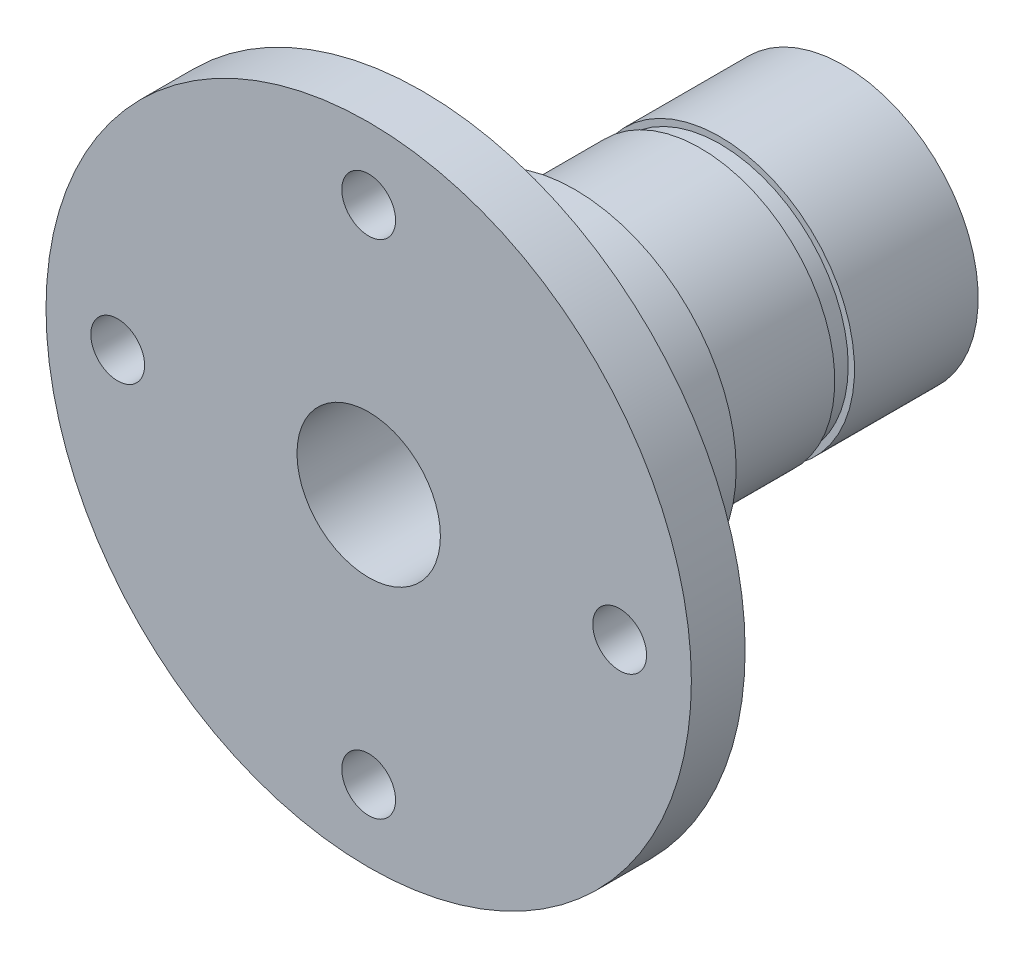
ISO-10303-21;
HEADER;
FILE_DESCRIPTION(('STEP AP214'),'2;1');
FILE_NAME('part.step','',(''),(''),'','','');
FILE_SCHEMA(('AUTOMOTIVE_DESIGN { 1 0 10303 214 1 1 1 1 }'));
ENDSEC;
DATA;
#1=APPLICATION_CONTEXT('core data for automotive mechanical design processes');
#2=APPLICATION_PROTOCOL_DEFINITION('international standard','automotive_design',2000,#1);
#3=PRODUCT_CONTEXT('',#1,'mechanical');
#4=PRODUCT('Part','Part','',(#3));
#5=PRODUCT_RELATED_PRODUCT_CATEGORY('part','',(#4));
#6=PRODUCT_DEFINITION_FORMATION('','',#4);
#7=PRODUCT_DEFINITION_CONTEXT('part definition',#1,'design');
#8=PRODUCT_DEFINITION('design','',#6,#7);
#9=PRODUCT_DEFINITION_SHAPE('','',#8);
#10=(LENGTH_UNIT() NAMED_UNIT(*) SI_UNIT(.MILLI.,.METRE.));
#11=(NAMED_UNIT(*) PLANE_ANGLE_UNIT() SI_UNIT($,.RADIAN.));
#12=(NAMED_UNIT(*) SI_UNIT($,.STERADIAN.) SOLID_ANGLE_UNIT());
#13=UNCERTAINTY_MEASURE_WITH_UNIT(LENGTH_MEASURE(1.E-05),#10,'distance_accuracy_value','');
#14=(GEOMETRIC_REPRESENTATION_CONTEXT(3) GLOBAL_UNCERTAINTY_ASSIGNED_CONTEXT((#13)) GLOBAL_UNIT_ASSIGNED_CONTEXT((#10,
#11,#12)) REPRESENTATION_CONTEXT('',''));
#15=CARTESIAN_POINT('',(0.,0.,0.));
#16=DIRECTION('',(0.,0.,1.));
#17=DIRECTION('',(1.,0.,0.));
#18=AXIS2_PLACEMENT_3D('',#15,#16,#17);
#19=CARTESIAN_POINT('',(0.,0.,-23.5));
#20=DIRECTION('',(0.,0.,1.));
#21=DIRECTION('',(1.,0.,0.));
#22=AXIS2_PLACEMENT_3D('',#19,#20,#21);
#23=CYLINDRICAL_SURFACE('',#22,7.5);
#24=CARTESIAN_POINT('',(0.,0.,-8.5));
#25=DIRECTION('',(0.,0.,-1.));
#26=DIRECTION('',(-1.,0.,0.));
#27=AXIS2_PLACEMENT_3D('',#24,#25,#26);
#28=CIRCLE('',#27,7.5);
#29=CARTESIAN_POINT('',(-7.5,0.,-8.5));
#30=VERTEX_POINT('',#29);
#31=EDGE_CURVE('E10',#30,#30,#28,.T.);
#32=ORIENTED_EDGE('',*,*,#31,.T.);
#33=EDGE_LOOP('',(#32));
#34=FACE_BOUND('',#33,.T.);
#35=CARTESIAN_POINT('',(0.,0.,-15.5));
#36=DIRECTION('',(0.,0.,-1.));
#37=DIRECTION('',(-1.,0.,0.));
#38=AXIS2_PLACEMENT_3D('',#35,#36,#37);
#39=CIRCLE('',#38,7.5);
#40=CARTESIAN_POINT('',(-7.5,0.,-15.5));
#41=VERTEX_POINT('',#40);
#42=EDGE_CURVE('E143',#41,#41,#39,.T.);
#43=ORIENTED_EDGE('',*,*,#42,.F.);
#44=EDGE_LOOP('',(#43));
#45=FACE_BOUND('',#44,.T.);
#46=ADVANCED_FACE('F33',(#34,#45),#23,.T.);
#47=CARTESIAN_POINT('',(0.,0.,0.));
#48=DIRECTION('',(0.,0.,1.));
#49=DIRECTION('',(1.,0.,0.));
#50=AXIS2_PLACEMENT_3D('',#47,#48,#49);
#51=PLANE('',#50);
#52=CARTESIAN_POINT('',(-13.9999999999997,-3.12516339054529E-13,0.));
#53=DIRECTION('',(0.,0.,1.));
#54=DIRECTION('',(1.,0.,0.));
#55=AXIS2_PLACEMENT_3D('',#52,#53,#54);
#56=CIRCLE('',#55,1.50000000000067);
#57=CARTESIAN_POINT('',(-12.499999999999,-3.12516339054529E-13,0.));
#58=VERTEX_POINT('',#57);
#59=EDGE_CURVE('E53',#58,#58,#56,.T.);
#60=ORIENTED_EDGE('',*,*,#59,.T.);
#61=EDGE_LOOP('',(#60));
#62=FACE_BOUND('',#61,.T.);
#63=CARTESIAN_POINT('',(6.21603667071446E-13,-14.,0.));
#64=DIRECTION('',(0.,0.,1.));
#65=DIRECTION('',(1.,0.,0.));
#66=AXIS2_PLACEMENT_3D('',#63,#64,#65);
#67=CIRCLE('',#66,1.50000000000067);
#68=CARTESIAN_POINT('',(1.50000000000129,-14.,0.));
#69=VERTEX_POINT('',#68);
#70=EDGE_CURVE('E57',#69,#69,#67,.T.);
#71=ORIENTED_EDGE('',*,*,#70,.T.);
#72=EDGE_LOOP('',(#71));
#73=FACE_BOUND('',#72,.T.);
#74=CARTESIAN_POINT('',(14.0000000000003,3.10801833535723E-13,0.));
#75=DIRECTION('',(0.,0.,1.));
#76=DIRECTION('',(1.,0.,0.));
#77=AXIS2_PLACEMENT_3D('',#74,#75,#76);
#78=CIRCLE('',#77,1.50000000000067);
#79=CARTESIAN_POINT('',(15.500000000001,3.10801833535723E-13,0.));
#80=VERTEX_POINT('',#79);
#81=EDGE_CURVE('E63',#80,#80,#78,.T.);
#82=ORIENTED_EDGE('',*,*,#81,.T.);
#83=EDGE_LOOP('',(#82));
#84=FACE_BOUND('',#83,.T.);
#85=CARTESIAN_POINT('',(0.,14.,0.));
#86=DIRECTION('',(0.,0.,1.));
#87=DIRECTION('',(1.,0.,0.));
#88=AXIS2_PLACEMENT_3D('',#85,#86,#87);
#89=CIRCLE('',#88,1.50000000000067);
#90=CARTESIAN_POINT('',(1.50000000000067,14.,0.));
#91=VERTEX_POINT('',#90);
#92=EDGE_CURVE('E69',#91,#91,#89,.T.);
#93=ORIENTED_EDGE('',*,*,#92,.T.);
#94=EDGE_LOOP('',(#93));
#95=FACE_BOUND('',#94,.T.);
#96=CARTESIAN_POINT('',(0.,0.,0.));
#97=DIRECTION('',(0.,0.,1.));
#98=DIRECTION('',(1.,0.,0.));
#99=AXIS2_PLACEMENT_3D('',#96,#97,#98);
#100=CIRCLE('',#99,18.);
#101=CARTESIAN_POINT('',(18.,0.,0.));
#102=VERTEX_POINT('',#101);
#103=EDGE_CURVE('E80',#102,#102,#100,.T.);
#104=ORIENTED_EDGE('',*,*,#103,.F.);
#105=EDGE_LOOP('',(#104));
#106=FACE_BOUND('',#105,.T.);
#107=CARTESIAN_POINT('',(0.,0.,0.));
#108=DIRECTION('',(0.,0.,1.));
#109=DIRECTION('',(1.,0.,0.));
#110=AXIS2_PLACEMENT_3D('',#107,#108,#109);
#111=CIRCLE('',#110,9.);
#112=CARTESIAN_POINT('',(9.,0.,0.));
#113=VERTEX_POINT('',#112);
#114=EDGE_CURVE('E37',#113,#113,#111,.F.);
#115=ORIENTED_EDGE('',*,*,#114,.F.);
#116=EDGE_LOOP('',(#115));
#117=FACE_BOUND('',#116,.T.);
#118=ADVANCED_FACE('F86',(#62,#73,#84,#95,#106,#117),#51,.F.);
#119=CARTESIAN_POINT('',(0.,0.,3.));
#120=DIRECTION('',(0.,0.,1.));
#121=DIRECTION('',(1.,0.,0.));
#122=AXIS2_PLACEMENT_3D('',#119,#120,#121);
#123=PLANE('',#122);
#124=CARTESIAN_POINT('',(6.21603667071446E-13,-14.,3.));
#125=DIRECTION('',(0.,0.,1.));
#126=DIRECTION('',(1.,0.,0.));
#127=AXIS2_PLACEMENT_3D('',#124,#125,#126);
#128=CIRCLE('',#127,1.50000000000067);
#129=CARTESIAN_POINT('',(1.50000000000129,-14.,3.));
#130=VERTEX_POINT('',#129);
#131=EDGE_CURVE('E60',#130,#130,#128,.T.);
#132=ORIENTED_EDGE('',*,*,#131,.F.);
#133=EDGE_LOOP('',(#132));
#134=FACE_BOUND('',#133,.T.);
#135=CARTESIAN_POINT('',(0.,14.,3.));
#136=DIRECTION('',(0.,0.,1.));
#137=DIRECTION('',(1.,0.,0.));
#138=AXIS2_PLACEMENT_3D('',#135,#136,#137);
#139=CIRCLE('',#138,1.50000000000067);
#140=CARTESIAN_POINT('',(1.50000000000067,14.,3.));
#141=VERTEX_POINT('',#140);
#142=EDGE_CURVE('E72',#141,#141,#139,.T.);
#143=ORIENTED_EDGE('',*,*,#142,.F.);
#144=EDGE_LOOP('',(#143));
#145=FACE_BOUND('',#144,.T.);
#146=CARTESIAN_POINT('',(0.,0.,3.));
#147=DIRECTION('',(0.,0.,1.));
#148=DIRECTION('',(1.,0.,0.));
#149=AXIS2_PLACEMENT_3D('',#146,#147,#148);
#150=CIRCLE('',#149,18.);
#151=CARTESIAN_POINT('',(18.,0.,3.));
#152=VERTEX_POINT('',#151);
#153=EDGE_CURVE('E45',#152,#152,#150,.T.);
#154=ORIENTED_EDGE('',*,*,#153,.T.);
#155=EDGE_LOOP('',(#154));
#156=FACE_BOUND('',#155,.T.);
#157=CARTESIAN_POINT('',(0.,0.,3.));
#158=DIRECTION('',(0.,0.,1.));
#159=DIRECTION('',(1.,0.,0.));
#160=AXIS2_PLACEMENT_3D('',#157,#158,#159);
#161=CIRCLE('',#160,4.);
#162=CARTESIAN_POINT('',(4.,0.,3.));
#163=VERTEX_POINT('',#162);
#164=EDGE_CURVE('E75',#163,#163,#161,.T.);
#165=ORIENTED_EDGE('',*,*,#164,.F.);
#166=EDGE_LOOP('',(#165));
#167=FACE_BOUND('',#166,.T.);
#168=CARTESIAN_POINT('',(14.0000000000003,3.10801833535723E-13,3.));
#169=DIRECTION('',(0.,0.,1.));
#170=DIRECTION('',(1.,0.,0.));
#171=AXIS2_PLACEMENT_3D('',#168,#169,#170);
#172=CIRCLE('',#171,1.50000000000067);
#173=CARTESIAN_POINT('',(15.500000000001,3.10801833535723E-13,3.));
#174=VERTEX_POINT('',#173);
#175=EDGE_CURVE('E66',#174,#174,#172,.T.);
#176=ORIENTED_EDGE('',*,*,#175,.F.);
#177=EDGE_LOOP('',(#176));
#178=FACE_BOUND('',#177,.T.);
#179=CARTESIAN_POINT('',(-13.9999999999997,-3.12516339054529E-13,3.));
#180=DIRECTION('',(0.,0.,1.));
#181=DIRECTION('',(1.,0.,0.));
#182=AXIS2_PLACEMENT_3D('',#179,#180,#181);
#183=CIRCLE('',#182,1.50000000000067);
#184=CARTESIAN_POINT('',(-12.499999999999,-3.12516339054529E-13,3.));
#185=VERTEX_POINT('',#184);
#186=EDGE_CURVE('E54',#185,#185,#183,.T.);
#187=ORIENTED_EDGE('',*,*,#186,.F.);
#188=EDGE_LOOP('',(#187));
#189=FACE_BOUND('',#188,.T.);
#190=ADVANCED_FACE('F89',(#134,#145,#156,#167,#178,#189),#123,.T.);
#191=CARTESIAN_POINT('',(0.,0.,3.));
#192=DIRECTION('',(0.,0.,-1.));
#193=DIRECTION('',(-1.,0.,0.));
#194=AXIS2_PLACEMENT_3D('',#191,#192,#193);
#195=CYLINDRICAL_SURFACE('',#194,18.);
#196=ORIENTED_EDGE('',*,*,#153,.F.);
#197=EDGE_LOOP('',(#196));
#198=FACE_BOUND('',#197,.T.);
#199=ORIENTED_EDGE('',*,*,#103,.T.);
#200=EDGE_LOOP('',(#199));
#201=FACE_BOUND('',#200,.T.);
#202=ADVANCED_FACE('F35',(#198,#201),#195,.T.);
#203=CARTESIAN_POINT('',(0.,0.,3.));
#204=DIRECTION('',(0.,0.,-1.));
#205=DIRECTION('',(-1.,0.,0.));
#206=AXIS2_PLACEMENT_3D('',#203,#204,#205);
#207=CYLINDRICAL_SURFACE('',#206,4.);
#208=CARTESIAN_POINT('',(-4.,0.,-19.1));
#209=CARTESIAN_POINT('',(-4.00000217456151,-0.0812350589378528,-19.0999970976969));
#210=CARTESIAN_POINT('',(-3.99750379283184,-0.162450241781792,-19.1066197602484));
#211=CARTESIAN_POINT('',(-3.98778696006928,-0.322453452352361,-19.1328281952699));
#212=CARTESIAN_POINT('',(-3.98056918893993,-0.401241827987616,-19.1524121004706));
#213=CARTESIAN_POINT('',(-3.96218832391545,-0.554060784990879,-19.2037530017718));
#214=CARTESIAN_POINT('',(-3.9510328434944,-0.628100224162278,-19.2354865168218));
#215=CARTESIAN_POINT('',(-3.92588767765353,-0.769799310160255,-19.3101064130158));
#216=CARTESIAN_POINT('',(-3.91189723227548,-0.83745723917788,-19.3529957855442));
#217=CARTESIAN_POINT('',(-3.88186246971217,-0.967346417045826,-19.4506125310709));
#218=CARTESIAN_POINT('',(-3.86576002583566,-1.02927073015119,-19.5057302622594));
#219=CARTESIAN_POINT('',(-3.83360220871327,-1.14324421474363,-19.6254104346588));
#220=CARTESIAN_POINT('',(-3.81754685135033,-1.19529036359203,-19.6899757560879));
#221=CARTESIAN_POINT('',(-3.78662470617731,-1.28998202215985,-19.8297174675232));
#222=CARTESIAN_POINT('',(-3.77182648820818,-1.3321939319576,-19.9052043665458));
#223=CARTESIAN_POINT('',(-3.74599860237433,-1.40318646334085,-20.0628483541685));
#224=CARTESIAN_POINT('',(-3.73496742975881,-1.43197244961239,-20.1450027631551));
#225=CARTESIAN_POINT('',(-3.71854412824136,-1.47408431017549,-20.3101167402582));
#226=CARTESIAN_POINT('',(-3.71293924350838,-1.48799593218558,-20.3929050384354));
#227=CARTESIAN_POINT('',(-3.70738061461215,-1.50179556531648,-20.5598161579938));
#228=CARTESIAN_POINT('',(-3.70742453659305,-1.50168936802631,-20.6439384138745));
#229=CARTESIAN_POINT('',(-3.71297511632055,-1.48790429610018,-20.805769525213));
#230=CARTESIAN_POINT('',(-3.71815468871121,-1.47503808509003,-20.8835609060442));
#231=CARTESIAN_POINT('',(-3.73284938059529,-1.4374416786833,-21.0357871504053));
#232=CARTESIAN_POINT('',(-3.74236515298863,-1.41270969663258,-21.1102215066139));
#233=CARTESIAN_POINT('',(-3.76485702190253,-1.35163748571904,-21.2552770677282));
#234=CARTESIAN_POINT('',(-3.77789517988166,-1.31508648737101,-21.3257994861213));
#235=CARTESIAN_POINT('',(-3.80594210139319,-1.23156073762698,-21.459945737591));
#236=CARTESIAN_POINT('',(-3.82095154457158,-1.18458238728897,-21.5235671775197));
#237=CARTESIAN_POINT('',(-3.85248038859113,-1.07781780766549,-21.6466036636509));
#238=CARTESIAN_POINT('',(-3.86903347455671,-1.01738298716956,-21.7054486407481));
#239=CARTESIAN_POINT('',(-3.90091728164085,-0.887312590819021,-21.8123379662058));
#240=CARTESIAN_POINT('',(-3.91624781465952,-0.817675603497364,-21.8603806546057));
#241=CARTESIAN_POINT('',(-3.9442639480908,-0.66972343699242,-21.9449303970625));
#242=CARTESIAN_POINT('',(-3.95690498259616,-0.59129071384472,-21.9812475812211));
#243=CARTESIAN_POINT('',(-3.97778718326962,-0.428836850524584,-22.03998260427));
#244=CARTESIAN_POINT('',(-3.98603030341493,-0.344818210845768,-22.0624066165611));
#245=CARTESIAN_POINT('',(-3.99684443228065,-0.178375243148666,-22.0916227875419));
#246=CARTESIAN_POINT('',(-3.99969369025686,-0.0961036195622097,-22.0991826063825));
#247=CARTESIAN_POINT('',(-4.00025893700126,0.0685724752550241,-22.1006910638999));
#248=CARTESIAN_POINT('',(-3.99797606386863,0.150976912983373,-22.0946427203168));
#249=CARTESIAN_POINT('',(-3.98871709772643,0.310262048561859,-22.0696899576913));
#250=CARTESIAN_POINT('',(-3.98192470962305,0.387233328007336,-22.0512884562629));
#251=CARTESIAN_POINT('',(-3.96451477091717,0.53694175495722,-22.0028139274527));
#252=CARTESIAN_POINT('',(-3.9538967228203,0.609678350347534,-21.972739382052));
#253=CARTESIAN_POINT('',(-3.92949624407681,0.751247765110155,-21.9008135875605));
#254=CARTESIAN_POINT('',(-3.91563000209348,0.819903083557796,-21.8586422707766));
#255=CARTESIAN_POINT('',(-3.88626671564664,0.949392711726626,-21.7640818968284));
#256=CARTESIAN_POINT('',(-3.87076907009516,1.01022412027045,-21.7116890674548));
#257=CARTESIAN_POINT('',(-3.83873329490989,1.12603079874454,-21.5945958778757));
#258=CARTESIAN_POINT('',(-3.82218696503729,1.18046154123569,-21.5293578172273));
#259=CARTESIAN_POINT('',(-3.79078815746854,1.27771050031903,-21.3903486152923));
#260=CARTESIAN_POINT('',(-3.77593583194399,1.32052767414519,-21.3165767086115));
#261=CARTESIAN_POINT('',(-3.74966829822463,1.39337773518998,-21.1619840132277));
#262=CARTESIAN_POINT('',(-3.73826760328493,1.42335685446918,-21.0811352540896));
#263=CARTESIAN_POINT('',(-3.72054032891005,1.46907883466889,-20.9149902363122));
#264=CARTESIAN_POINT('',(-3.71421061057491,1.48483050305535,-20.8296967638019));
#265=CARTESIAN_POINT('',(-3.70775894792573,1.50086347097839,-20.6629838404589));
#266=CARTESIAN_POINT('',(-3.70726444523341,1.50207331495837,-20.5816673682831));
#267=CARTESIAN_POINT('',(-3.71158412745292,1.49136715641593,-20.4200546837238));
#268=CARTESIAN_POINT('',(-3.71639780898899,1.47945239850124,-20.3397583753284));
#269=CARTESIAN_POINT('',(-3.73048141585432,1.44355815630242,-20.1849527732834));
#270=CARTESIAN_POINT('',(-3.73961085376663,1.41995798316524,-20.1103416537547));
#271=CARTESIAN_POINT('',(-3.76121548297845,1.3616969677992,-19.9660944915056));
#272=CARTESIAN_POINT('',(-3.77369151995215,1.32703332944945,-19.8964597119299));
#273=CARTESIAN_POINT('',(-3.80139723903965,1.24552075938154,-19.7601732103024));
#274=CARTESIAN_POINT('',(-3.81673698440964,1.1981283280301,-19.6938692032001));
#275=CARTESIAN_POINT('',(-3.84806246757177,1.09334485729906,-19.5698584390288));
#276=CARTESIAN_POINT('',(-3.86404840943145,1.03595064012808,-19.5121544252132));
#277=CARTESIAN_POINT('',(-3.89590424609881,0.909080396784624,-19.4037980441782));
#278=CARTESIAN_POINT('',(-3.91172104900645,0.839118644212993,-19.3536962465653));
#279=CARTESIAN_POINT('',(-3.9405451445703,0.691213223200822,-19.2659773447234));
#280=CARTESIAN_POINT('',(-3.95355221851559,0.613268934090623,-19.2283612122636));
#281=CARTESIAN_POINT('',(-3.9757429260668,0.447999082002313,-19.1656231709517));
#282=CARTESIAN_POINT('',(-3.98473657158356,0.360413422234208,-19.1411129353981));
#283=CARTESIAN_POINT('',(-3.99686242179587,0.181875733606382,-19.1083070400793));
#284=CARTESIAN_POINT('',(-3.99999756603967,0.0909254163648587,-19.1000032485127));
#285=CARTESIAN_POINT('',(-4.,0.,-19.1));
#286=B_SPLINE_CURVE_WITH_KNOTS('',3,(#208,#209,#210,#211,#212,#213,#214,#215,#216,#217,#218,
#219,#220,#221,#222,#223,#224,#225,#226,#227,#228,#229,#230,#231,#232,#233,#234,#235,#236,#237,
#238,#239,#240,#241,#242,#243,#244,#245,#246,#247,#248,#249,#250,#251,#252,#253,#254,#255,#256,
#257,#258,#259,#260,#261,#262,#263,#264,#265,#266,#267,#268,#269,#270,#271,#272,#273,#274,#275,
#276,#277,#278,#279,#280,#281,#282,#283,#284,#285),.UNSPECIFIED.,.T.,.F.,(4,2,2,2,2,2,2,2,2,2,2,
2,2,2,2,2,2,2,2,2,2,2,2,2,2,2,2,2,2,2,2,2,2,2,2,2,2,2,4),(0.,0.24336980156056,0.48670454953046,
0.729571369213573,0.972503379609492,1.22473618582716,1.47704604925622,1.73896674501659,
2.00078269352134,2.25185874416902,2.50283106079707,2.73878345119972,2.97477138060589,
3.21522408387018,3.45575990744259,3.71246153335813,3.96920257905066,4.22991375286075,
4.49050899698846,4.73725019635926,4.98393668390521,5.2211443792384,5.45838293254454,
5.702592218596,5.94689180019868,6.20536519455658,6.46386178920141,6.72343066727204,
6.98283874956507,7.22558763480252,7.4683135021126,7.70363142426534,7.93900886656507,
8.18672471884272,8.43451941997063,8.69572329654039,8.95694749805103,9.22948515032043,
9.50188601796128),.UNSPECIFIED.);
#287=CARTESIAN_POINT('',(-4.,0.,-19.1));
#288=VERTEX_POINT('',#287);
#289=EDGE_CURVE('E347',#288,#288,#286,.T.);
#290=ORIENTED_EDGE('',*,*,#289,.F.);
#291=EDGE_LOOP('',(#290));
#292=FACE_BOUND('',#291,.T.);
#293=CARTESIAN_POINT('',(0.,-4.,-19.1));
#294=CARTESIAN_POINT('',(0.0812350589378528,-4.00000217456151,-19.0999970976969));
#295=CARTESIAN_POINT('',(0.162450241781792,-3.99750379283184,-19.1066197602484));
#296=CARTESIAN_POINT('',(0.322453452352361,-3.98778696006928,-19.1328281952699));
#297=CARTESIAN_POINT('',(0.401241827987616,-3.98056918893993,-19.1524121004706));
#298=CARTESIAN_POINT('',(0.554060784990879,-3.96218832391545,-19.2037530017718));
#299=CARTESIAN_POINT('',(0.628100224162278,-3.9510328434944,-19.2354865168218));
#300=CARTESIAN_POINT('',(0.769799310160254,-3.92588767765353,-19.3101064130158));
#301=CARTESIAN_POINT('',(0.83745723917788,-3.91189723227548,-19.3529957855442));
#302=CARTESIAN_POINT('',(0.967346417045826,-3.88186246971217,-19.4506125310709));
#303=CARTESIAN_POINT('',(1.02927073015119,-3.86576002583566,-19.5057302622594));
#304=CARTESIAN_POINT('',(1.14324421474363,-3.83360220871327,-19.6254104346588));
#305=CARTESIAN_POINT('',(1.19529036359203,-3.81754685135033,-19.6899757560879));
#306=CARTESIAN_POINT('',(1.28998202215985,-3.78662470617731,-19.8297174675232));
#307=CARTESIAN_POINT('',(1.3321939319576,-3.77182648820818,-19.9052043665458));
#308=CARTESIAN_POINT('',(1.40318646334085,-3.74599860237433,-20.0628483541685));
#309=CARTESIAN_POINT('',(1.43197244961239,-3.73496742975881,-20.1450027631551));
#310=CARTESIAN_POINT('',(1.47408431017549,-3.71854412824136,-20.3101167402582));
#311=CARTESIAN_POINT('',(1.48799593218558,-3.71293924350838,-20.3929050384354));
#312=CARTESIAN_POINT('',(1.50179556531648,-3.70738061461215,-20.5598161579938));
#313=CARTESIAN_POINT('',(1.50168936802631,-3.70742453659305,-20.6439384138745));
#314=CARTESIAN_POINT('',(1.48790429610018,-3.71297511632055,-20.805769525213));
#315=CARTESIAN_POINT('',(1.47503808509003,-3.71815468871122,-20.8835609060442));
#316=CARTESIAN_POINT('',(1.4374416786833,-3.73284938059529,-21.0357871504053));
#317=CARTESIAN_POINT('',(1.41270969663258,-3.74236515298863,-21.1102215066139));
#318=CARTESIAN_POINT('',(1.35163748571904,-3.76485702190253,-21.2552770677282));
#319=CARTESIAN_POINT('',(1.31508648737101,-3.77789517988166,-21.3257994861213));
#320=CARTESIAN_POINT('',(1.23156073762698,-3.80594210139319,-21.459945737591));
#321=CARTESIAN_POINT('',(1.18458238728897,-3.82095154457158,-21.5235671775197));
#322=CARTESIAN_POINT('',(1.07781780766549,-3.85248038859113,-21.6466036636509));
#323=CARTESIAN_POINT('',(1.01738298716956,-3.86903347455671,-21.7054486407481));
#324=CARTESIAN_POINT('',(0.887312590819022,-3.90091728164085,-21.8123379662058));
#325=CARTESIAN_POINT('',(0.817675603497365,-3.91624781465952,-21.8603806546057));
#326=CARTESIAN_POINT('',(0.66972343699242,-3.9442639480908,-21.9449303970625));
#327=CARTESIAN_POINT('',(0.591290713844719,-3.95690498259616,-21.9812475812211));
#328=CARTESIAN_POINT('',(0.428836850524583,-3.97778718326962,-22.03998260427));
#329=CARTESIAN_POINT('',(0.344818210845767,-3.98603030341493,-22.0624066165611));
#330=CARTESIAN_POINT('',(0.178375243148665,-3.99684443228065,-22.0916227875419));
#331=CARTESIAN_POINT('',(0.0961036195622087,-3.99969369025686,-22.0991826063825));
#332=CARTESIAN_POINT('',(-0.0685724752550249,-4.00025893700126,-22.1006910638999));
#333=CARTESIAN_POINT('',(-0.150976912983373,-3.99797606386863,-22.0946427203168));
#334=CARTESIAN_POINT('',(-0.31026204856186,-3.98871709772643,-22.0696899576913));
#335=CARTESIAN_POINT('',(-0.387233328007337,-3.98192470962305,-22.0512884562629));
#336=CARTESIAN_POINT('',(-0.536941754957222,-3.96451477091717,-22.0028139274527));
#337=CARTESIAN_POINT('',(-0.609678350347535,-3.9538967228203,-21.972739382052));
#338=CARTESIAN_POINT('',(-0.751247765110156,-3.92949624407681,-21.9008135875605));
#339=CARTESIAN_POINT('',(-0.819903083557796,-3.91563000209348,-21.8586422707766));
#340=CARTESIAN_POINT('',(-0.949392711726626,-3.88626671564664,-21.7640818968284));
#341=CARTESIAN_POINT('',(-1.01022412027045,-3.87076907009516,-21.7116890674548));
#342=CARTESIAN_POINT('',(-1.12603079874454,-3.83873329490989,-21.5945958778757));
#343=CARTESIAN_POINT('',(-1.18046154123569,-3.82218696503729,-21.5293578172273));
#344=CARTESIAN_POINT('',(-1.27771050031903,-3.79078815746854,-21.3903486152923));
#345=CARTESIAN_POINT('',(-1.32052767414519,-3.77593583194399,-21.3165767086115));
#346=CARTESIAN_POINT('',(-1.39337773518998,-3.74966829822463,-21.1619840132277));
#347=CARTESIAN_POINT('',(-1.42335685446918,-3.73826760328493,-21.0811352540896));
#348=CARTESIAN_POINT('',(-1.46907883466889,-3.72054032891005,-20.9149902363122));
#349=CARTESIAN_POINT('',(-1.48483050305535,-3.71421061057491,-20.8296967638019));
#350=CARTESIAN_POINT('',(-1.50086347097839,-3.70775894792573,-20.6629838404589));
#351=CARTESIAN_POINT('',(-1.50207331495837,-3.70726444523341,-20.5816673682831));
#352=CARTESIAN_POINT('',(-1.49136715641593,-3.71158412745292,-20.4200546837238));
#353=CARTESIAN_POINT('',(-1.47945239850124,-3.71639780898899,-20.3397583753284));
#354=CARTESIAN_POINT('',(-1.44355815630242,-3.73048141585432,-20.1849527732834));
#355=CARTESIAN_POINT('',(-1.41995798316524,-3.73961085376663,-20.1103416537547));
#356=CARTESIAN_POINT('',(-1.3616969677992,-3.76121548297845,-19.9660944915056));
#357=CARTESIAN_POINT('',(-1.32703332944945,-3.77369151995215,-19.8964597119299));
#358=CARTESIAN_POINT('',(-1.24552075938154,-3.80139723903965,-19.7601732103024));
#359=CARTESIAN_POINT('',(-1.1981283280301,-3.81673698440964,-19.6938692032001));
#360=CARTESIAN_POINT('',(-1.09334485729906,-3.84806246757177,-19.5698584390288));
#361=CARTESIAN_POINT('',(-1.03595064012808,-3.86404840943145,-19.5121544252132));
#362=CARTESIAN_POINT('',(-0.909080396784623,-3.89590424609881,-19.4037980441782));
#363=CARTESIAN_POINT('',(-0.839118644212993,-3.91172104900645,-19.3536962465653));
#364=CARTESIAN_POINT('',(-0.691213223200822,-3.94054514457031,-19.2659773447234));
#365=CARTESIAN_POINT('',(-0.613268934090622,-3.95355221851559,-19.2283612122636));
#366=CARTESIAN_POINT('',(-0.447999082002312,-3.9757429260668,-19.1656231709517));
#367=CARTESIAN_POINT('',(-0.360413422234208,-3.98473657158356,-19.1411129353981));
#368=CARTESIAN_POINT('',(-0.181875733606382,-3.99686242179587,-19.1083070400793));
#369=CARTESIAN_POINT('',(-0.0909254163648589,-3.99999756603967,-19.1000032485127));
#370=CARTESIAN_POINT('',(0.,-4.,-19.1));
#371=B_SPLINE_CURVE_WITH_KNOTS('',3,(#293,#294,#295,#296,#297,#298,#299,#300,#301,#302,#303,
#304,#305,#306,#307,#308,#309,#310,#311,#312,#313,#314,#315,#316,#317,#318,#319,#320,#321,#322,
#323,#324,#325,#326,#327,#328,#329,#330,#331,#332,#333,#334,#335,#336,#337,#338,#339,#340,#341,
#342,#343,#344,#345,#346,#347,#348,#349,#350,#351,#352,#353,#354,#355,#356,#357,#358,#359,#360,
#361,#362,#363,#364,#365,#366,#367,#368,#369,#370),.UNSPECIFIED.,.T.,.F.,(4,2,2,2,2,2,2,2,2,2,2,
2,2,2,2,2,2,2,2,2,2,2,2,2,2,2,2,2,2,2,2,2,2,2,2,2,2,2,4),(0.,0.24336980156056,0.48670454953046,
0.729571369213575,0.972503379609491,1.22473618582716,1.47704604925622,1.73896674501659,
2.00078269352134,2.25185874416902,2.50283106079707,2.73878345119971,2.97477138060589,
3.21522408387018,3.45575990744258,3.71246153335812,3.96920257905066,4.22991375286075,
4.49050899698846,4.73725019635925,4.98393668390521,5.2211443792384,5.45838293254454,
5.702592218596,5.94689180019868,6.20536519455658,6.46386178920141,6.72343066727204,
6.98283874956507,7.22558763480252,7.46831350211259,7.70363142426534,7.93900886656507,
8.18672471884272,8.43451941997062,8.69572329654039,8.95694749805102,9.22948515032042,
9.50188601796128),.UNSPECIFIED.);
#372=CARTESIAN_POINT('',(0.,-4.,-19.1));
#373=VERTEX_POINT('',#372);
#374=EDGE_CURVE('E152',#373,#373,#371,.T.);
#375=ORIENTED_EDGE('',*,*,#374,.F.);
#376=EDGE_LOOP('',(#375));
#377=FACE_BOUND('',#376,.T.);
#378=ORIENTED_EDGE('',*,*,#164,.T.);
#379=EDGE_LOOP('',(#378));
#380=FACE_BOUND('',#379,.T.);
#381=CARTESIAN_POINT('',(0.,0.,-23.5));
#382=DIRECTION('',(0.,0.,-1.));
#383=DIRECTION('',(-1.,0.,0.));
#384=AXIS2_PLACEMENT_3D('',#381,#382,#383);
#385=CIRCLE('',#384,4.);
#386=CARTESIAN_POINT('',(-4.,0.,-23.5));
#387=VERTEX_POINT('',#386);
#388=EDGE_CURVE('E139',#387,#387,#385,.T.);
#389=ORIENTED_EDGE('',*,*,#388,.T.);
#390=EDGE_LOOP('',(#389));
#391=FACE_BOUND('',#390,.T.);
#392=ADVANCED_FACE('F167',(#292,#377,#380,#391),#207,.F.);
#393=CARTESIAN_POINT('',(0.,14.,3.));
#394=DIRECTION('',(0.,0.,-1.));
#395=DIRECTION('',(-1.,0.,0.));
#396=AXIS2_PLACEMENT_3D('',#393,#394,#395);
#397=CYLINDRICAL_SURFACE('',#396,1.50000000000067);
#398=ORIENTED_EDGE('',*,*,#142,.T.);
#399=EDGE_LOOP('',(#398));
#400=FACE_BOUND('',#399,.T.);
#401=ORIENTED_EDGE('',*,*,#92,.F.);
#402=EDGE_LOOP('',(#401));
#403=FACE_BOUND('',#402,.T.);
#404=ADVANCED_FACE('F224',(#400,#403),#397,.F.);
#405=CARTESIAN_POINT('',(14.0000000000003,3.10801833535723E-13,3.));
#406=DIRECTION('',(0.,0.,-1.));
#407=DIRECTION('',(-1.,0.,0.));
#408=AXIS2_PLACEMENT_3D('',#405,#406,#407);
#409=CYLINDRICAL_SURFACE('',#408,1.50000000000067);
#410=ORIENTED_EDGE('',*,*,#175,.T.);
#411=EDGE_LOOP('',(#410));
#412=FACE_BOUND('',#411,.T.);
#413=ORIENTED_EDGE('',*,*,#81,.F.);
#414=EDGE_LOOP('',(#413));
#415=FACE_BOUND('',#414,.T.);
#416=ADVANCED_FACE('F239',(#412,#415),#409,.F.);
#417=CARTESIAN_POINT('',(6.21603667071446E-13,-14.,3.));
#418=DIRECTION('',(0.,0.,-1.));
#419=DIRECTION('',(-1.,0.,0.));
#420=AXIS2_PLACEMENT_3D('',#417,#418,#419);
#421=CYLINDRICAL_SURFACE('',#420,1.50000000000067);
#422=ORIENTED_EDGE('',*,*,#131,.T.);
#423=EDGE_LOOP('',(#422));
#424=FACE_BOUND('',#423,.T.);
#425=ORIENTED_EDGE('',*,*,#70,.F.);
#426=EDGE_LOOP('',(#425));
#427=FACE_BOUND('',#426,.T.);
#428=ADVANCED_FACE('F246',(#424,#427),#421,.F.);
#429=CARTESIAN_POINT('',(-13.9999999999997,-3.12516339054529E-13,3.));
#430=DIRECTION('',(0.,0.,-1.));
#431=DIRECTION('',(-1.,0.,0.));
#432=AXIS2_PLACEMENT_3D('',#429,#430,#431);
#433=CYLINDRICAL_SURFACE('',#432,1.50000000000067);
#434=ORIENTED_EDGE('',*,*,#186,.T.);
#435=EDGE_LOOP('',(#434));
#436=FACE_BOUND('',#435,.T.);
#437=ORIENTED_EDGE('',*,*,#59,.F.);
#438=EDGE_LOOP('',(#437));
#439=FACE_BOUND('',#438,.T.);
#440=ADVANCED_FACE('F106',(#436,#439),#433,.F.);
#441=CARTESIAN_POINT('',(0.,0.,-8.5));
#442=DIRECTION('',(0.,0.,-1.));
#443=DIRECTION('',(-1.,0.,0.));
#444=AXIS2_PLACEMENT_3D('',#441,#442,#443);
#445=PLANE('',#444);
#446=ORIENTED_EDGE('',*,*,#31,.F.);
#447=EDGE_LOOP('',(#446));
#448=FACE_BOUND('',#447,.T.);
#449=CARTESIAN_POINT('',(0.,0.,-8.5));
#450=DIRECTION('',(0.,0.,-1.));
#451=DIRECTION('',(-1.,0.,0.));
#452=AXIS2_PLACEMENT_3D('',#449,#450,#451);
#453=CIRCLE('',#452,9.);
#454=CARTESIAN_POINT('',(-9.,0.,-8.5));
#455=VERTEX_POINT('',#454);
#456=EDGE_CURVE('E50',#455,#455,#453,.T.);
#457=ORIENTED_EDGE('',*,*,#456,.T.);
#458=EDGE_LOOP('',(#457));
#459=FACE_BOUND('',#458,.T.);
#460=ADVANCED_FACE('F96',(#448,#459),#445,.T.);
#461=CARTESIAN_POINT('',(0.,0.,-8.5));
#462=DIRECTION('',(0.,0.,1.));
#463=DIRECTION('',(1.,0.,0.));
#464=AXIS2_PLACEMENT_3D('',#461,#462,#463);
#465=CYLINDRICAL_SURFACE('',#464,9.);
#466=ORIENTED_EDGE('',*,*,#456,.F.);
#467=EDGE_LOOP('',(#466));
#468=FACE_BOUND('',#467,.T.);
#469=ORIENTED_EDGE('',*,*,#114,.T.);
#470=EDGE_LOOP('',(#469));
#471=FACE_BOUND('',#470,.T.);
#472=ADVANCED_FACE('F93',(#468,#471),#465,.T.);
#473=CARTESIAN_POINT('',(0.,0.,-23.5));
#474=DIRECTION('',(0.,0.,-1.));
#475=DIRECTION('',(-1.,0.,0.));
#476=AXIS2_PLACEMENT_3D('',#473,#474,#475);
#477=PLANE('',#476);
#478=CARTESIAN_POINT('',(0.,0.,-23.5));
#479=DIRECTION('',(0.,0.,-1.));
#480=DIRECTION('',(-1.,0.,0.));
#481=AXIS2_PLACEMENT_3D('',#478,#479,#480);
#482=CIRCLE('',#481,7.5);
#483=CARTESIAN_POINT('',(-7.5,0.,-23.5));
#484=VERTEX_POINT('',#483);
#485=EDGE_CURVE('E48',#484,#484,#482,.T.);
#486=ORIENTED_EDGE('',*,*,#485,.T.);
#487=EDGE_LOOP('',(#486));
#488=FACE_BOUND('',#487,.T.);
#489=ORIENTED_EDGE('',*,*,#388,.F.);
#490=EDGE_LOOP('',(#489));
#491=FACE_BOUND('',#490,.T.);
#492=ADVANCED_FACE('F95',(#488,#491),#477,.T.);
#493=CARTESIAN_POINT('',(-7.5,0.,-22.1));
#494=CARTESIAN_POINT('',(-7.49999846371307,-0.0833653601889497,-22.0999969332525));
#495=CARTESIAN_POINT('',(-7.49859577767346,-0.166769490302283,-22.0930267355485));
#496=CARTESIAN_POINT('',(-7.49313548434847,-0.331220261533529,-22.0653522498271));
#497=CARTESIAN_POINT('',(-7.48907576790279,-0.412264976312033,-22.0446370507977));
#498=CARTESIAN_POINT('',(-7.4787547391743,-0.569595457894969,-21.9901380895688));
#499=CARTESIAN_POINT('',(-7.47249553615077,-0.645885701899701,-21.956366844733));
#500=CARTESIAN_POINT('',(-7.45845597052971,-0.791711983296338,-21.8767516287331));
#501=CARTESIAN_POINT('',(-7.4506756985356,-0.861248422613717,-21.8309083765892));
#502=CARTESIAN_POINT('',(-7.43433247994955,-0.992540215972296,-21.7277922585629));
#503=CARTESIAN_POINT('',(-7.42576118256521,-1.05419092673778,-21.6703874669132));
#504=CARTESIAN_POINT('',(-7.40886270678882,-1.16705513491204,-21.5460613754124));
#505=CARTESIAN_POINT('',(-7.40053554750636,-1.21826781715564,-21.4791393329973));
#506=CARTESIAN_POINT('',(-7.38498662718923,-1.30924763002143,-21.3369257104822));
#507=CARTESIAN_POINT('',(-7.37777561047419,-1.3489064082988,-21.2615635343055));
#508=CARTESIAN_POINT('',(-7.36539402087627,-1.41495849987046,-21.1050772714939));
#509=CARTESIAN_POINT('',(-7.36022324642942,-1.44135312365586,-21.0239537549805));
#510=CARTESIAN_POINT('',(-7.35259207878307,-1.47978794982724,-20.8593734541381));
#511=CARTESIAN_POINT('',(-7.35009705160781,-1.49201174693817,-20.7759611837867));
#512=CARTESIAN_POINT('',(-7.34799562590941,-1.50232819158918,-20.6082352679535));
#513=CARTESIAN_POINT('',(-7.34838893201761,-1.50042228407025,-20.5239217155198));
#514=CARTESIAN_POINT('',(-7.35198826722277,-1.48268185965273,-20.3581298179685));
#515=CARTESIAN_POINT('',(-7.35515179288145,-1.46705781036586,-20.276627891559));
#516=CARTESIAN_POINT('',(-7.36386819240002,-1.42265682693458,-20.1174258850055));
#517=CARTESIAN_POINT('',(-7.36942118036668,-1.39387926465102,-20.0397259866215));
#518=CARTESIAN_POINT('',(-7.38233427750612,-1.32378717551208,-19.8897271074446));
#519=CARTESIAN_POINT('',(-7.38970634720557,-1.28238922684817,-19.8174681806462));
#520=CARTESIAN_POINT('',(-7.40541928159593,-1.18829036185902,-19.6808437250408));
#521=CARTESIAN_POINT('',(-7.41376025757549,-1.13558814653524,-19.6164791047233));
#522=CARTESIAN_POINT('',(-7.43065531862193,-1.01924990184088,-19.4962558963146));
#523=CARTESIAN_POINT('',(-7.43921053816357,-0.955434241818668,-19.4405711482113));
#524=CARTESIAN_POINT('',(-7.45543273071613,-0.819277536093016,-19.3406692305482));
#525=CARTESIAN_POINT('',(-7.4630996923346,-0.746936381069084,-19.2964522080596));
#526=CARTESIAN_POINT('',(-7.47670035241331,-0.595589080318383,-19.220708736161));
#527=CARTESIAN_POINT('',(-7.48263133272408,-0.516572729377953,-19.1892021595332));
#528=CARTESIAN_POINT('',(-7.49207113481787,-0.354223464673001,-19.1399592889422));
#529=CARTESIAN_POINT('',(-7.49558025000797,-0.270891075108678,-19.1222213268896));
#530=CARTESIAN_POINT('',(-7.49974007800301,-0.103769108440729,-19.1012653193086));
#531=CARTESIAN_POINT('',(-7.50043761978705,-0.020010492488367,-19.0978093706896));
#532=CARTESIAN_POINT('',(-7.49902577895154,0.146887401289069,-19.1048747884133));
#533=CARTESIAN_POINT('',(-7.49691655412169,0.230026713665688,-19.1153953690289));
#534=CARTESIAN_POINT('',(-7.49015748012026,0.39255848991981,-19.1499175603159));
#535=CARTESIAN_POINT('',(-7.4855306460631,0.471977922509853,-19.1737971027469));
#536=CARTESIAN_POINT('',(-7.47425328091549,0.6256854412495,-19.2342259739837));
#537=CARTESIAN_POINT('',(-7.4676025982134,0.699973142456308,-19.2707762520152));
#538=CARTESIAN_POINT('',(-7.45289867299942,0.842311760529325,-19.356023735977));
#539=CARTESIAN_POINT('',(-7.44482925655578,0.91027519012828,-19.4048641715584));
#540=CARTESIAN_POINT('',(-7.42822102244824,1.03712702867881,-19.5131137868109));
#541=CARTESIAN_POINT('',(-7.41968215452582,1.09601446339614,-19.5725240995998));
#542=CARTESIAN_POINT('',(-7.40293955335447,1.20396088616126,-19.7013100278367));
#543=CARTESIAN_POINT('',(-7.39474290349956,1.25285655367298,-19.770823616332));
#544=CARTESIAN_POINT('',(-7.37976287694291,1.33827813007681,-19.917217042035));
#545=CARTESIAN_POINT('',(-7.37297944370014,1.37480453388435,-19.9940965843603));
#546=CARTESIAN_POINT('',(-7.36165110876574,1.43422776237294,-20.1526523692243));
#547=CARTESIAN_POINT('',(-7.3570946230828,1.45719524968658,-20.2343012618155));
#548=CARTESIAN_POINT('',(-7.35071155188038,1.48906297744079,-20.4004001802364));
#549=CARTESIAN_POINT('',(-7.34888461036667,1.49796505233767,-20.484849839314));
#550=CARTESIAN_POINT('',(-7.34818724447069,1.5013813663012,-20.6525132968165));
#551=CARTESIAN_POINT('',(-7.34926378783951,1.49615368210634,-20.7357217233905));
#552=CARTESIAN_POINT('',(-7.35413360226921,1.47202845615009,-20.9000474748575));
#553=CARTESIAN_POINT('',(-7.35792685150754,1.45313102419395,-20.9811648165422));
#554=CARTESIAN_POINT('',(-7.36777896328738,1.40231785274843,-21.1388415668608));
#555=CARTESIAN_POINT('',(-7.37383231528246,1.37043376007602,-21.2154115407536));
#556=CARTESIAN_POINT('',(-7.38752572461255,1.29458196690241,-21.3621555811017));
#557=CARTESIAN_POINT('',(-7.39516591498341,1.25061325316233,-21.4323291105877));
#558=CARTESIAN_POINT('',(-7.41133440784838,1.15095887217962,-21.5655733582255));
#559=CARTESIAN_POINT('',(-7.41987559364549,1.09508683085277,-21.6285031479014));
#560=CARTESIAN_POINT('',(-7.43679122807932,0.973596553519714,-21.7441793082938));
#561=CARTESIAN_POINT('',(-7.44516563794777,0.907976080730004,-21.7969233354759));
#562=CARTESIAN_POINT('',(-7.46090748581957,0.76802644363237,-21.8912519659197));
#563=CARTESIAN_POINT('',(-7.46826346828869,0.693613326644753,-21.93271400492));
#564=CARTESIAN_POINT('',(-7.481026876275,0.5387495414111,-22.0024791838949));
#565=CARTESIAN_POINT('',(-7.48643605707924,0.45830439129469,-22.0307941842987));
#566=CARTESIAN_POINT('',(-7.49364558893056,0.314732233385671,-22.0679779220671));
#567=CARTESIAN_POINT('',(-7.49601454737678,0.252422496020679,-22.0799647905616));
#568=CARTESIAN_POINT('',(-7.49919231209839,0.126749287815102,-22.0959768685375));
#569=CARTESIAN_POINT('',(-7.50000116809732,0.0633858506229293,-22.1000023317647));
#570=CARTESIAN_POINT('',(-7.5,0.,-22.1));
#571=B_SPLINE_CURVE_WITH_KNOTS('',3,(#493,#494,#495,#496,#497,#498,#499,#500,#501,#502,#503,
#504,#505,#506,#507,#508,#509,#510,#511,#512,#513,#514,#515,#516,#517,#518,#519,#520,#521,#522,
#523,#524,#525,#526,#527,#528,#529,#530,#531,#532,#533,#534,#535,#536,#537,#538,#539,#540,#541,
#542,#543,#544,#545,#546,#547,#548,#549,#550,#551,#552,#553,#554,#555,#556,#557,#558,#559,#560,
#561,#562,#563,#564,#565,#566,#567,#568,#569,#570),.UNSPECIFIED.,.T.,.F.,(4,2,2,2,2,2,2,2,2,2,2,
2,2,2,2,2,2,2,2,2,2,2,2,2,2,2,2,2,2,2,2,2,2,2,2,2,2,2,4),(0.,0.249864195991887,
0.499926976036984,0.749750602875512,0.999559353346293,1.25239900516828,1.50525839512105,
1.76041792508884,2.01555224047796,2.26734277655381,2.51910756421838,2.76707590509418,
3.01505608880595,3.26471235305389,3.51439732124506,3.76857378737026,4.0227535130973,
4.27732912281036,4.53187388547054,4.78216103514398,5.03243411486801,5.28045680926085,
5.52849808824034,5.77957599050038,6.03068082518895,6.28560942868839,6.540527830852,
6.79410571549085,7.04765052495622,7.29659583851552,7.54553915238913,7.79387941879665,
8.042240513728,8.29482114358714,8.54745981799396,8.80274245013456,9.05779433276278,
9.24778162934841,9.43776287056495),.UNSPECIFIED.);
#572=CARTESIAN_POINT('',(-7.5,0.,-22.1));
#573=VERTEX_POINT('',#572);
#574=EDGE_CURVE('E128',#573,#573,#571,.T.);
#575=ORIENTED_EDGE('',*,*,#574,.F.);
#576=EDGE_LOOP('',(#575));
#577=FACE_BOUND('',#576,.T.);
#578=CARTESIAN_POINT('',(0.,-7.5,-19.1));
#579=CARTESIAN_POINT('',(-0.0833653601889498,-7.49999846371307,-19.1000030667475));
#580=CARTESIAN_POINT('',(-0.166769490302284,-7.49859577767346,-19.1069732644515));
#581=CARTESIAN_POINT('',(-0.331220261533529,-7.49313548434847,-19.1346477501729));
#582=CARTESIAN_POINT('',(-0.412264976312033,-7.48907576790279,-19.1553629492023));
#583=CARTESIAN_POINT('',(-0.569595457894969,-7.4787547391743,-19.2098619104312));
#584=CARTESIAN_POINT('',(-0.645885701899702,-7.47249553615077,-19.243633155267));
#585=CARTESIAN_POINT('',(-0.791711983296338,-7.45845597052971,-19.3232483712669));
#586=CARTESIAN_POINT('',(-0.861248422613717,-7.4506756985356,-19.3690916234108));
#587=CARTESIAN_POINT('',(-0.992540215972296,-7.43433247994955,-19.4722077414372));
#588=CARTESIAN_POINT('',(-1.05419092673779,-7.42576118256521,-19.5296125330868));
#589=CARTESIAN_POINT('',(-1.16705513491204,-7.40886270678882,-19.6539386245875));
#590=CARTESIAN_POINT('',(-1.21826781715564,-7.40053554750636,-19.7208606670027));
#591=CARTESIAN_POINT('',(-1.30924763002143,-7.38498662718923,-19.8630742895178));
#592=CARTESIAN_POINT('',(-1.3489064082988,-7.37777561047419,-19.9384364656945));
#593=CARTESIAN_POINT('',(-1.41495849987046,-7.36539402087627,-20.0949227285061));
#594=CARTESIAN_POINT('',(-1.44135312365586,-7.36022324642942,-20.1760462450195));
#595=CARTESIAN_POINT('',(-1.47978794982724,-7.35259207878307,-20.3406265458619));
#596=CARTESIAN_POINT('',(-1.49201174693817,-7.35009705160781,-20.4240388162133));
#597=CARTESIAN_POINT('',(-1.50232819158918,-7.34799562590941,-20.5917647320465));
#598=CARTESIAN_POINT('',(-1.50042228407025,-7.34838893201761,-20.6760782844802));
#599=CARTESIAN_POINT('',(-1.48268185965273,-7.35198826722277,-20.8418701820315));
#600=CARTESIAN_POINT('',(-1.46705781036586,-7.35515179288145,-20.923372108441));
#601=CARTESIAN_POINT('',(-1.42265682693458,-7.36386819240002,-21.0825741149945));
#602=CARTESIAN_POINT('',(-1.39387926465102,-7.36942118036668,-21.1602740133785));
#603=CARTESIAN_POINT('',(-1.32378717551208,-7.38233427750612,-21.3102728925554));
#604=CARTESIAN_POINT('',(-1.28238922684817,-7.38970634720557,-21.3825318193538));
#605=CARTESIAN_POINT('',(-1.18829036185902,-7.40541928159593,-21.5191562749592));
#606=CARTESIAN_POINT('',(-1.13558814653524,-7.41376025757549,-21.5835208952767));
#607=CARTESIAN_POINT('',(-1.01924990184088,-7.43065531862193,-21.7037441036854));
#608=CARTESIAN_POINT('',(-0.955434241818668,-7.43921053816357,-21.7594288517887));
#609=CARTESIAN_POINT('',(-0.819277536093015,-7.45543273071613,-21.8593307694518));
#610=CARTESIAN_POINT('',(-0.746936381069084,-7.4630996923346,-21.9035477919404));
#611=CARTESIAN_POINT('',(-0.595589080318381,-7.47670035241331,-21.979291263839));
#612=CARTESIAN_POINT('',(-0.51657272937795,-7.48263133272408,-22.0107978404668));
#613=CARTESIAN_POINT('',(-0.354223464672998,-7.49207113481787,-22.0600407110578));
#614=CARTESIAN_POINT('',(-0.270891075108676,-7.49558025000797,-22.0777786731104));
#615=CARTESIAN_POINT('',(-0.103769108440728,-7.49974007800302,-22.0987346806914));
#616=CARTESIAN_POINT('',(-0.0200104924883661,-7.50043761978705,-22.1021906293104));
#617=CARTESIAN_POINT('',(0.14688740128907,-7.49902577895154,-22.0951252115867));
#618=CARTESIAN_POINT('',(0.230026713665689,-7.49691655412169,-22.0846046309711));
#619=CARTESIAN_POINT('',(0.392558489919811,-7.49015748012026,-22.0500824396841));
#620=CARTESIAN_POINT('',(0.471977922509854,-7.4855306460631,-22.0262028972531));
#621=CARTESIAN_POINT('',(0.6256854412495,-7.47425328091549,-21.9657740260163));
#622=CARTESIAN_POINT('',(0.699973142456309,-7.4676025982134,-21.9292237479848));
#623=CARTESIAN_POINT('',(0.842311760529325,-7.45289867299942,-21.843976264023));
#624=CARTESIAN_POINT('',(0.91027519012828,-7.44482925655578,-21.7951358284416));
#625=CARTESIAN_POINT('',(1.03712702867881,-7.42822102244824,-21.6868862131891));
#626=CARTESIAN_POINT('',(1.09601446339614,-7.41968215452582,-21.6274759004002));
#627=CARTESIAN_POINT('',(1.20396088616126,-7.40293955335447,-21.4986899721633));
#628=CARTESIAN_POINT('',(1.25285655367298,-7.39474290349956,-21.429176383668));
#629=CARTESIAN_POINT('',(1.33827813007681,-7.37976287694291,-21.282782957965));
#630=CARTESIAN_POINT('',(1.37480453388435,-7.37297944370014,-21.2059034156397));
#631=CARTESIAN_POINT('',(1.43422776237294,-7.36165110876574,-21.0473476307757));
#632=CARTESIAN_POINT('',(1.45719524968658,-7.3570946230828,-20.9656987381845));
#633=CARTESIAN_POINT('',(1.48906297744079,-7.35071155188038,-20.7995998197636));
#634=CARTESIAN_POINT('',(1.49796505233767,-7.34888461036667,-20.715150160686));
#635=CARTESIAN_POINT('',(1.5013813663012,-7.34818724447069,-20.5474867031835));
#636=CARTESIAN_POINT('',(1.49615368210634,-7.34926378783951,-20.4642782766095));
#637=CARTESIAN_POINT('',(1.47202845615009,-7.35413360226921,-20.2999525251425));
#638=CARTESIAN_POINT('',(1.45313102419395,-7.35792685150754,-20.2188351834578));
#639=CARTESIAN_POINT('',(1.40231785274843,-7.36777896328738,-20.0611584331392));
#640=CARTESIAN_POINT('',(1.37043376007602,-7.37383231528246,-19.9845884592464));
#641=CARTESIAN_POINT('',(1.29458196690241,-7.38752572461255,-19.8378444188983));
#642=CARTESIAN_POINT('',(1.25061325316232,-7.39516591498341,-19.7676708894123));
#643=CARTESIAN_POINT('',(1.15095887217962,-7.41133440784838,-19.6344266417745));
#644=CARTESIAN_POINT('',(1.09508683085277,-7.41987559364549,-19.5714968520986));
#645=CARTESIAN_POINT('',(0.97359655351971,-7.43679122807932,-19.4558206917062));
#646=CARTESIAN_POINT('',(0.907976080730002,-7.44516563794777,-19.4030766645241));
#647=CARTESIAN_POINT('',(0.76802644363237,-7.46090748581957,-19.3087480340803));
#648=CARTESIAN_POINT('',(0.693613326644754,-7.46826346828869,-19.26728599508));
#649=CARTESIAN_POINT('',(0.538749541411101,-7.481026876275,-19.1975208161051));
#650=CARTESIAN_POINT('',(0.458304391294691,-7.48643605707924,-19.1692058157013));
#651=CARTESIAN_POINT('',(0.31473223338567,-7.49364558893056,-19.1320220779329));
#652=CARTESIAN_POINT('',(0.252422496020678,-7.49601454737678,-19.1200352094384));
#653=CARTESIAN_POINT('',(0.126749287815101,-7.49919231209839,-19.1040231314625));
#654=CARTESIAN_POINT('',(0.0633858506229289,-7.50000116809732,-19.0999976682353));
#655=CARTESIAN_POINT('',(0.,-7.5,-19.1));
#656=B_SPLINE_CURVE_WITH_KNOTS('',3,(#578,#579,#580,#581,#582,#583,#584,#585,#586,#587,#588,
#589,#590,#591,#592,#593,#594,#595,#596,#597,#598,#599,#600,#601,#602,#603,#604,#605,#606,#607,
#608,#609,#610,#611,#612,#613,#614,#615,#616,#617,#618,#619,#620,#621,#622,#623,#624,#625,#626,
#627,#628,#629,#630,#631,#632,#633,#634,#635,#636,#637,#638,#639,#640,#641,#642,#643,#644,#645,
#646,#647,#648,#649,#650,#651,#652,#653,#654,#655),.UNSPECIFIED.,.T.,.F.,(4,2,2,2,2,2,2,2,2,2,2,
2,2,2,2,2,2,2,2,2,2,2,2,2,2,2,2,2,2,2,2,2,2,2,2,2,2,2,4),(0.,0.249864195991888,
0.499926976036985,0.749750602875512,0.999559353346295,1.25239900516828,1.50525839512105,
1.76041792508884,2.01555224047797,2.26734277655381,2.51910756421838,2.76707590509418,
3.01505608880595,3.26471235305388,3.51439732124506,3.76857378737026,4.0227535130973,
4.27732912281036,4.53187388547054,4.78216103514398,5.03243411486801,5.28045680926085,
5.52849808824034,5.77957599050038,6.03068082518895,6.28560942868838,6.540527830852,
6.79410571549084,7.04765052495622,7.29659583851552,7.54553915238912,7.79387941879665,
8.042240513728,8.29482114358715,8.54745981799396,8.80274245013456,9.05779433276278,
9.24778162934841,9.43776287056495),.UNSPECIFIED.);
#657=CARTESIAN_POINT('',(0.,-7.5,-19.1));
#658=VERTEX_POINT('',#657);
#659=EDGE_CURVE('E132',#658,#658,#656,.T.);
#660=ORIENTED_EDGE('',*,*,#659,.F.);
#661=EDGE_LOOP('',(#660));
#662=FACE_BOUND('',#661,.T.);
#663=CARTESIAN_POINT('',(0.,0.,-16.6));
#664=DIRECTION('',(0.,0.,-1.));
#665=DIRECTION('',(-1.,0.,0.));
#666=AXIS2_PLACEMENT_3D('',#663,#664,#665);
#667=CIRCLE('',#666,7.5);
#668=CARTESIAN_POINT('',(-7.5,0.,-16.6));
#669=VERTEX_POINT('',#668);
#670=EDGE_CURVE('E136',#669,#669,#667,.T.);
#671=ORIENTED_EDGE('',*,*,#670,.T.);
#672=EDGE_LOOP('',(#671));
#673=FACE_BOUND('',#672,.T.);
#674=ORIENTED_EDGE('',*,*,#485,.F.);
#675=EDGE_LOOP('',(#674));
#676=FACE_BOUND('',#675,.T.);
#677=ADVANCED_FACE('F103',(#577,#662,#673,#676),#23,.T.);
#678=CARTESIAN_POINT('',(0.,0.,-16.6));
#679=DIRECTION('',(0.,0.,-1.));
#680=DIRECTION('',(-1.,0.,0.));
#681=AXIS2_PLACEMENT_3D('',#678,#679,#680);
#682=PLANE('',#681);
#683=ORIENTED_EDGE('',*,*,#670,.F.);
#684=EDGE_LOOP('',(#683));
#685=FACE_BOUND('',#684,.T.);
#686=CARTESIAN_POINT('',(0.,0.,-16.6));
#687=DIRECTION('',(0.,0.,-1.));
#688=DIRECTION('',(-1.,0.,0.));
#689=AXIS2_PLACEMENT_3D('',#686,#687,#688);
#690=CIRCLE('',#689,7.15);
#691=CARTESIAN_POINT('',(-7.15,0.,-16.6));
#692=VERTEX_POINT('',#691);
#693=EDGE_CURVE('E147',#692,#692,#690,.T.);
#694=ORIENTED_EDGE('',*,*,#693,.T.);
#695=EDGE_LOOP('',(#694));
#696=FACE_BOUND('',#695,.T.);
#697=ADVANCED_FACE('F117',(#685,#696),#682,.F.);
#698=CARTESIAN_POINT('',(0.,0.,-15.5));
#699=DIRECTION('',(0.,0.,-1.));
#700=DIRECTION('',(-1.,0.,0.));
#701=AXIS2_PLACEMENT_3D('',#698,#699,#700);
#702=PLANE('',#701);
#703=ORIENTED_EDGE('',*,*,#42,.T.);
#704=EDGE_LOOP('',(#703));
#705=FACE_BOUND('',#704,.T.);
#706=CARTESIAN_POINT('',(0.,0.,-15.5));
#707=DIRECTION('',(0.,0.,-1.));
#708=DIRECTION('',(-1.,0.,0.));
#709=AXIS2_PLACEMENT_3D('',#706,#707,#708);
#710=CIRCLE('',#709,7.15);
#711=CARTESIAN_POINT('',(-7.15,0.,-15.5));
#712=VERTEX_POINT('',#711);
#713=EDGE_CURVE('E149',#712,#712,#710,.T.);
#714=ORIENTED_EDGE('',*,*,#713,.F.);
#715=EDGE_LOOP('',(#714));
#716=FACE_BOUND('',#715,.T.);
#717=ADVANCED_FACE('F122',(#705,#716),#702,.T.);
#718=CARTESIAN_POINT('',(0.,0.,-16.6));
#719=DIRECTION('',(0.,0.,1.));
#720=DIRECTION('',(1.,0.,0.));
#721=AXIS2_PLACEMENT_3D('',#718,#719,#720);
#722=CYLINDRICAL_SURFACE('',#721,7.15);
#723=ORIENTED_EDGE('',*,*,#693,.F.);
#724=EDGE_LOOP('',(#723));
#725=FACE_BOUND('',#724,.T.);
#726=ORIENTED_EDGE('',*,*,#713,.T.);
#727=EDGE_LOOP('',(#726));
#728=FACE_BOUND('',#727,.T.);
#729=ADVANCED_FACE('F176',(#725,#728),#722,.T.);
#730=CARTESIAN_POINT('',(0.,-18.001,-20.6));
#731=DIRECTION('',(0.,1.,0.));
#732=DIRECTION('',(0.,0.,1.));
#733=AXIS2_PLACEMENT_3D('',#730,#731,#732);
#734=CYLINDRICAL_SURFACE('',#733,1.5);
#735=ORIENTED_EDGE('',*,*,#374,.T.);
#736=EDGE_LOOP('',(#735));
#737=FACE_BOUND('',#736,.T.);
#738=ORIENTED_EDGE('',*,*,#659,.T.);
#739=EDGE_LOOP('',(#738));
#740=FACE_BOUND('',#739,.T.);
#741=ADVANCED_FACE('F171',(#737,#740),#734,.F.);
#742=CARTESIAN_POINT('',(-18.001,0.,-20.6));
#743=DIRECTION('',(1.,0.,0.));
#744=DIRECTION('',(0.,0.,-1.));
#745=AXIS2_PLACEMENT_3D('',#742,#743,#744);
#746=CYLINDRICAL_SURFACE('',#745,1.5);
#747=ORIENTED_EDGE('',*,*,#289,.T.);
#748=EDGE_LOOP('',(#747));
#749=FACE_BOUND('',#748,.T.);
#750=ORIENTED_EDGE('',*,*,#574,.T.);
#751=EDGE_LOOP('',(#750));
#752=FACE_BOUND('',#751,.T.);
#753=ADVANCED_FACE('F175',(#749,#752),#746,.F.);
#754=CLOSED_SHELL('',(#46,#118,#190,#202,#392,#404,#416,#428,#440,#460,#472,#492,#677,#697,#717,
#729,#741,#753));
#755=MANIFOLD_SOLID_BREP('B2',#754);
#756=ADVANCED_BREP_SHAPE_REPRESENTATION('',(#18,#755),#14);
#757=SHAPE_DEFINITION_REPRESENTATION(#9,#756);
ENDSEC;
END-ISO-10303-21;
